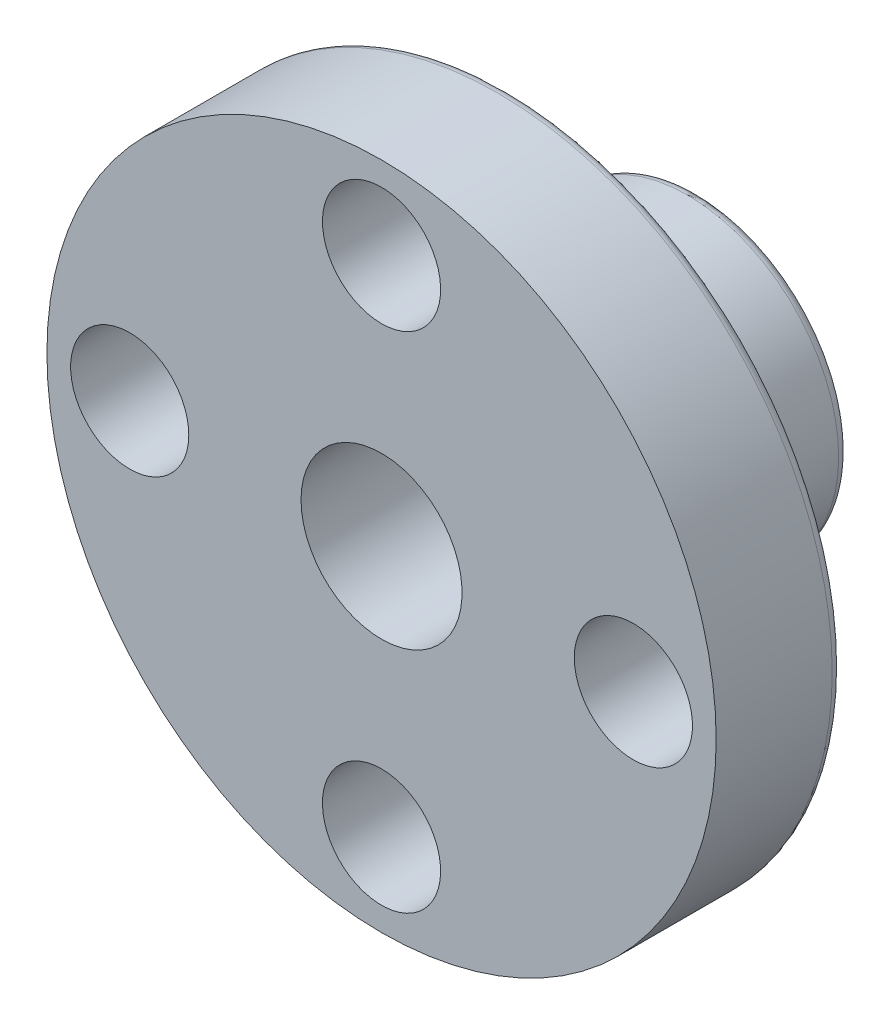
ISO-10303-21;
HEADER;
FILE_DESCRIPTION(('STEP AP214'),'2;1');
FILE_NAME('part.step','',(''),(''),'','','');
FILE_SCHEMA(('AUTOMOTIVE_DESIGN { 1 0 10303 214 1 1 1 1 }'));
ENDSEC;
DATA;
#1=APPLICATION_CONTEXT('core data for automotive mechanical design processes');
#2=APPLICATION_PROTOCOL_DEFINITION('international standard','automotive_design',2000,#1);
#3=PRODUCT_CONTEXT('',#1,'mechanical');
#4=PRODUCT('Part','Part','',(#3));
#5=PRODUCT_RELATED_PRODUCT_CATEGORY('part','',(#4));
#6=PRODUCT_DEFINITION_FORMATION('','',#4);
#7=PRODUCT_DEFINITION_CONTEXT('part definition',#1,'design');
#8=PRODUCT_DEFINITION('design','',#6,#7);
#9=PRODUCT_DEFINITION_SHAPE('','',#8);
#10=(LENGTH_UNIT() NAMED_UNIT(*) SI_UNIT(.MILLI.,.METRE.));
#11=(NAMED_UNIT(*) PLANE_ANGLE_UNIT() SI_UNIT($,.RADIAN.));
#12=(NAMED_UNIT(*) SI_UNIT($,.STERADIAN.) SOLID_ANGLE_UNIT());
#13=UNCERTAINTY_MEASURE_WITH_UNIT(LENGTH_MEASURE(1.E-05),#10,'distance_accuracy_value','');
#14=(GEOMETRIC_REPRESENTATION_CONTEXT(3) GLOBAL_UNCERTAINTY_ASSIGNED_CONTEXT((#13)) GLOBAL_UNIT_ASSIGNED_CONTEXT((#10,
#11,#12)) REPRESENTATION_CONTEXT('',''));
#15=CARTESIAN_POINT('',(0.,0.,0.));
#16=DIRECTION('',(0.,0.,1.));
#17=DIRECTION('',(1.,0.,0.));
#18=AXIS2_PLACEMENT_3D('',#15,#16,#17);
#19=CARTESIAN_POINT('',(0.,0.,30.48));
#20=DIRECTION('',(0.,0.,-1.));
#21=DIRECTION('',(-1.,0.,0.));
#22=AXIS2_PLACEMENT_3D('',#19,#20,#21);
#23=CYLINDRICAL_SURFACE('',#22,80.5625296455557);
#24=CARTESIAN_POINT('',(0.,0.,2.54));
#25=DIRECTION('',(0.,0.,1.));
#26=DIRECTION('',(1.,0.,0.));
#27=AXIS2_PLACEMENT_3D('',#24,#25,#26);
#28=CIRCLE('',#27,80.5625296455557);
#29=CARTESIAN_POINT('',(-80.5625296455557,0.,2.54));
#30=VERTEX_POINT('',#29);
#31=EDGE_CURVE('E46',#30,#30,#28,.T.);
#32=CARTESIAN_POINT('',(0.,0.,30.48));
#33=DIRECTION('',(0.,0.,1.));
#34=DIRECTION('',(1.,0.,0.));
#35=AXIS2_PLACEMENT_3D('',#32,#33,#34);
#36=CIRCLE('',#35,80.5625296455557);
#37=CARTESIAN_POINT('',(-80.5625296455557,0.,30.48));
#38=VERTEX_POINT('',#37);
#39=EDGE_CURVE('E65',#38,#38,#36,.T.);
#40=CARTESIAN_POINT('',(-80.5625296455557,0.,2.54));
#41=CARTESIAN_POINT('',(-80.5625296455557,0.,2.83104166666667));
#42=CARTESIAN_POINT('',(-80.5625296455557,0.,3.12208333333333));
#43=CARTESIAN_POINT('',(-80.5625296455557,0.,3.70416666666667));
#44=CARTESIAN_POINT('',(-80.5625296455557,0.,3.99520833333333));
#45=CARTESIAN_POINT('',(-80.5625296455557,0.,4.57729166666667));
#46=CARTESIAN_POINT('',(-80.5625296455557,0.,4.86833333333333));
#47=CARTESIAN_POINT('',(-80.5625296455557,0.,5.45041666666667));
#48=CARTESIAN_POINT('',(-80.5625296455557,0.,5.74145833333334));
#49=CARTESIAN_POINT('',(-80.5625296455557,0.,6.32354166666667));
#50=CARTESIAN_POINT('',(-80.5625296455557,0.,6.61458333333334));
#51=CARTESIAN_POINT('',(-80.5625296455557,0.,7.19666666666667));
#52=CARTESIAN_POINT('',(-80.5625296455557,0.,7.48770833333333));
#53=CARTESIAN_POINT('',(-80.5625296455557,0.,8.06979166666667));
#54=CARTESIAN_POINT('',(-80.5625296455557,0.,8.36083333333334));
#55=CARTESIAN_POINT('',(-80.5625296455557,0.,8.94291666666667));
#56=CARTESIAN_POINT('',(-80.5625296455557,0.,9.23395833333334));
#57=CARTESIAN_POINT('',(-80.5625296455557,0.,9.81604166666667));
#58=CARTESIAN_POINT('',(-80.5625296455557,0.,10.1070833333333));
#59=CARTESIAN_POINT('',(-80.5625296455557,0.,10.6891666666667));
#60=CARTESIAN_POINT('',(-80.5625296455557,0.,10.9802083333333));
#61=CARTESIAN_POINT('',(-80.5625296455557,0.,11.5622916666667));
#62=CARTESIAN_POINT('',(-80.5625296455557,0.,11.8533333333333));
#63=CARTESIAN_POINT('',(-80.5625296455557,0.,12.4354166666667));
#64=CARTESIAN_POINT('',(-80.5625296455557,0.,12.7264583333333));
#65=CARTESIAN_POINT('',(-80.5625296455557,0.,13.3085416666667));
#66=CARTESIAN_POINT('',(-80.5625296455557,0.,13.5995833333333));
#67=CARTESIAN_POINT('',(-80.5625296455557,0.,14.1816666666667));
#68=CARTESIAN_POINT('',(-80.5625296455557,0.,14.4727083333333));
#69=CARTESIAN_POINT('',(-80.5625296455557,0.,15.0547916666667));
#70=CARTESIAN_POINT('',(-80.5625296455557,0.,15.3458333333333));
#71=CARTESIAN_POINT('',(-80.5625296455557,0.,15.9279166666667));
#72=CARTESIAN_POINT('',(-80.5625296455557,0.,16.2189583333333));
#73=CARTESIAN_POINT('',(-80.5625296455557,0.,16.8010416666667));
#74=CARTESIAN_POINT('',(-80.5625296455557,0.,17.0920833333333));
#75=CARTESIAN_POINT('',(-80.5625296455557,0.,17.6741666666667));
#76=CARTESIAN_POINT('',(-80.5625296455557,0.,17.9652083333333));
#77=CARTESIAN_POINT('',(-80.5625296455557,0.,18.5472916666667));
#78=CARTESIAN_POINT('',(-80.5625296455557,0.,18.8383333333333));
#79=CARTESIAN_POINT('',(-80.5625296455557,0.,19.4204166666667));
#80=CARTESIAN_POINT('',(-80.5625296455557,0.,19.7114583333333));
#81=CARTESIAN_POINT('',(-80.5625296455557,0.,20.2935416666667));
#82=CARTESIAN_POINT('',(-80.5625296455557,0.,20.5845833333333));
#83=CARTESIAN_POINT('',(-80.5625296455557,0.,21.1666666666667));
#84=CARTESIAN_POINT('',(-80.5625296455557,0.,21.4577083333333));
#85=CARTESIAN_POINT('',(-80.5625296455557,0.,22.0397916666667));
#86=CARTESIAN_POINT('',(-80.5625296455557,0.,22.3308333333333));
#87=CARTESIAN_POINT('',(-80.5625296455557,0.,22.9129166666667));
#88=CARTESIAN_POINT('',(-80.5625296455557,0.,23.2039583333333));
#89=CARTESIAN_POINT('',(-80.5625296455557,0.,23.7860416666667));
#90=CARTESIAN_POINT('',(-80.5625296455557,0.,24.0770833333333));
#91=CARTESIAN_POINT('',(-80.5625296455557,0.,24.6591666666667));
#92=CARTESIAN_POINT('',(-80.5625296455557,0.,24.9502083333333));
#93=CARTESIAN_POINT('',(-80.5625296455557,0.,25.5322916666667));
#94=CARTESIAN_POINT('',(-80.5625296455557,0.,25.8233333333333));
#95=CARTESIAN_POINT('',(-80.5625296455557,0.,26.4054166666667));
#96=CARTESIAN_POINT('',(-80.5625296455557,0.,26.6964583333333));
#97=CARTESIAN_POINT('',(-80.5625296455557,0.,27.2785416666667));
#98=CARTESIAN_POINT('',(-80.5625296455557,0.,27.5695833333333));
#99=CARTESIAN_POINT('',(-80.5625296455557,0.,28.1516666666667));
#100=CARTESIAN_POINT('',(-80.5625296455557,0.,28.4427083333333));
#101=CARTESIAN_POINT('',(-80.5625296455557,0.,29.0247916666667));
#102=CARTESIAN_POINT('',(-80.5625296455557,0.,29.3158333333333));
#103=CARTESIAN_POINT('',(-80.5625296455557,0.,29.8979166666667));
#104=CARTESIAN_POINT('',(-80.5625296455557,0.,30.1889583333333));
#105=CARTESIAN_POINT('',(-80.5625296455557,0.,30.48));
#106=B_SPLINE_CURVE_WITH_KNOTS('',3,(#40,#41,#42,#43,#44,#45,#46,#47,#48,#49,#50,#51,#52,#53,
#54,#55,#56,#57,#58,#59,#60,#61,#62,#63,#64,#65,#66,#67,#68,#69,#70,#71,#72,#73,#74,#75,#76,#77,
#78,#79,#80,#81,#82,#83,#84,#85,#86,#87,#88,#89,#90,#91,#92,#93,#94,#95,#96,#97,#98,#99,#100,
#101,#102,#103,#104,#105),.UNSPECIFIED.,.F.,.F.,(4,2,2,2,2,2,2,2,2,2,2,2,2,2,2,2,2,2,2,2,2,2,2,
2,2,2,2,2,2,2,2,2,4),(0.,0.873124999999999,1.74625,2.619375,3.4925,4.365625,5.23875,6.111875,
6.985,7.858125,8.73125,9.604375,10.4775,11.350625,12.22375,13.096875,13.97,14.843125,15.71625,
16.589375,17.4625,18.335625,19.20875,20.081875,20.955,21.828125,22.70125,23.574375,24.4475,
25.320625,26.19375,27.066875,27.94),.UNSPECIFIED.);
#107=EDGE_CURVE('BSEAM39',#30,#38,#106,.T.);
#108=ORIENTED_EDGE('',*,*,#31,.T.);
#109=ORIENTED_EDGE('',*,*,#39,.F.);
#110=ORIENTED_EDGE('',*,*,#107,.T.);
#111=ORIENTED_EDGE('',*,*,#107,.F.);
#112=EDGE_LOOP('',(#108,#110,#109,#111));
#113=FACE_BOUND('',#112,.T.);
#114=ADVANCED_FACE('F39',(#113),#23,.T.);
#115=CARTESIAN_POINT('',(0.,0.,30.48));
#116=DIRECTION('',(0.,0.,1.));
#117=DIRECTION('',(1.,0.,0.));
#118=AXIS2_PLACEMENT_3D('',#115,#116,#117);
#119=PLANE('',#118);
#120=CARTESIAN_POINT('',(-60.6326289633329,0.,30.48));
#121=DIRECTION('',(0.,0.,-1.));
#122=DIRECTION('',(1.,0.,0.));
#123=AXIS2_PLACEMENT_3D('',#120,#121,#122);
#124=CIRCLE('',#123,14.2224685222633);
#125=CARTESIAN_POINT('',(-46.4101604410696,0.,30.48));
#126=VERTEX_POINT('',#125);
#127=EDGE_CURVE('E73',#126,#126,#124,.T.);
#128=ORIENTED_EDGE('',*,*,#127,.T.);
#129=EDGE_LOOP('',(#128));
#130=FACE_BOUND('',#129,.T.);
#131=CARTESIAN_POINT('',(6.35093077651429E-13,-60.6326289633329,30.48));
#132=DIRECTION('',(0.,0.,-1.));
#133=DIRECTION('',(0.,1.,0.));
#134=AXIS2_PLACEMENT_3D('',#131,#132,#133);
#135=CIRCLE('',#134,14.2224685222633);
#136=CARTESIAN_POINT('',(4.86120627338131E-13,-46.4101604410696,30.48));
#137=VERTEX_POINT('',#136);
#138=EDGE_CURVE('E93',#137,#137,#135,.T.);
#139=ORIENTED_EDGE('',*,*,#138,.T.);
#140=EDGE_LOOP('',(#139));
#141=FACE_BOUND('',#140,.T.);
#142=CARTESIAN_POINT('',(-2.11697692550476E-13,60.6326289633329,30.48));
#143=DIRECTION('',(0.,0.,-1.));
#144=DIRECTION('',(0.,-1.,0.));
#145=AXIS2_PLACEMENT_3D('',#142,#143,#144);
#146=CIRCLE('',#145,14.2224685222633);
#147=CARTESIAN_POINT('',(-1.6204020911271E-13,46.4101604410696,30.48));
#148=VERTEX_POINT('',#147);
#149=EDGE_CURVE('E69',#148,#148,#146,.T.);
#150=ORIENTED_EDGE('',*,*,#149,.T.);
#151=EDGE_LOOP('',(#150));
#152=FACE_BOUND('',#151,.T.);
#153=CARTESIAN_POINT('',(60.6326289633329,0.,30.48));
#154=DIRECTION('',(0.,0.,-1.));
#155=DIRECTION('',(-1.,0.,0.));
#156=AXIS2_PLACEMENT_3D('',#153,#154,#155);
#157=CIRCLE('',#156,14.2224685222633);
#158=CARTESIAN_POINT('',(46.4101604410696,0.,30.48));
#159=VERTEX_POINT('',#158);
#160=EDGE_CURVE('E77',#159,#159,#157,.T.);
#161=ORIENTED_EDGE('',*,*,#160,.T.);
#162=EDGE_LOOP('',(#161));
#163=FACE_BOUND('',#162,.T.);
#164=CARTESIAN_POINT('',(0.,0.,30.48));
#165=DIRECTION('',(0.,0.,-1.));
#166=DIRECTION('',(-1.,0.,0.));
#167=AXIS2_PLACEMENT_3D('',#164,#165,#166);
#168=CIRCLE('',#167,19.3838933480308);
#169=CARTESIAN_POINT('',(-19.3838933480308,0.,30.48));
#170=VERTEX_POINT('',#169);
#171=EDGE_CURVE('E84',#170,#170,#168,.T.);
#172=ORIENTED_EDGE('',*,*,#171,.T.);
#173=EDGE_LOOP('',(#172));
#174=FACE_BOUND('',#173,.T.);
#175=ORIENTED_EDGE('',*,*,#39,.T.);
#176=EDGE_LOOP('',(#175));
#177=FACE_BOUND('',#176,.T.);
#178=ADVANCED_FACE('F99',(#130,#141,#152,#163,#174,#177),#119,.T.);
#179=CARTESIAN_POINT('',(0.,0.,0.));
#180=DIRECTION('',(0.,0.,1.));
#181=DIRECTION('',(1.,0.,0.));
#182=AXIS2_PLACEMENT_3D('',#179,#180,#181);
#183=PLANE('',#182);
#184=CARTESIAN_POINT('',(0.,0.,0.));
#185=DIRECTION('',(0.,0.,1.));
#186=DIRECTION('',(1.,0.,0.));
#187=AXIS2_PLACEMENT_3D('',#184,#185,#186);
#188=CIRCLE('',#187,78.0225296455557);
#189=CARTESIAN_POINT('',(78.0225296455557,0.,0.));
#190=VERTEX_POINT('',#189);
#191=EDGE_CURVE('E10',#190,#190,#188,.F.);
#192=ORIENTED_EDGE('',*,*,#191,.T.);
#193=EDGE_LOOP('',(#192));
#194=FACE_BOUND('',#193,.T.);
#195=CARTESIAN_POINT('',(0.,0.,0.));
#196=DIRECTION('',(0.,0.,1.));
#197=DIRECTION('',(1.,0.,0.));
#198=AXIS2_PLACEMENT_3D('',#195,#196,#197);
#199=CIRCLE('',#198,38.9467974134491);
#200=CARTESIAN_POINT('',(38.9467974134491,0.,0.));
#201=VERTEX_POINT('',#200);
#202=EDGE_CURVE('E54',#201,#201,#199,.T.);
#203=ORIENTED_EDGE('',*,*,#202,.T.);
#204=EDGE_LOOP('',(#203));
#205=FACE_BOUND('',#204,.T.);
#206=CARTESIAN_POINT('',(-60.6326289633329,0.,0.));
#207=DIRECTION('',(0.,0.,1.));
#208=DIRECTION('',(1.,0.,0.));
#209=AXIS2_PLACEMENT_3D('',#206,#207,#208);
#210=CIRCLE('',#209,14.2224685222633);
#211=CARTESIAN_POINT('',(-46.4101604410696,0.,0.));
#212=VERTEX_POINT('',#211);
#213=EDGE_CURVE('E66',#212,#212,#210,.T.);
#214=ORIENTED_EDGE('',*,*,#213,.T.);
#215=EDGE_LOOP('',(#214));
#216=FACE_BOUND('',#215,.T.);
#217=CARTESIAN_POINT('',(6.35093077651429E-13,-60.6326289633329,0.));
#218=DIRECTION('',(0.,0.,1.));
#219=DIRECTION('',(1.,0.,0.));
#220=AXIS2_PLACEMENT_3D('',#217,#218,#219);
#221=CIRCLE('',#220,14.2224685222633);
#222=CARTESIAN_POINT('',(14.2224685222639,-60.6326289633329,0.));
#223=VERTEX_POINT('',#222);
#224=EDGE_CURVE('E70',#223,#223,#221,.T.);
#225=ORIENTED_EDGE('',*,*,#224,.T.);
#226=EDGE_LOOP('',(#225));
#227=FACE_BOUND('',#226,.T.);
#228=CARTESIAN_POINT('',(-2.11697692550476E-13,60.6326289633329,0.));
#229=DIRECTION('',(0.,0.,1.));
#230=DIRECTION('',(1.,0.,0.));
#231=AXIS2_PLACEMENT_3D('',#228,#229,#230);
#232=CIRCLE('',#231,14.2224685222633);
#233=CARTESIAN_POINT('',(14.2224685222631,60.6326289633329,0.));
#234=VERTEX_POINT('',#233);
#235=EDGE_CURVE('E74',#234,#234,#232,.T.);
#236=ORIENTED_EDGE('',*,*,#235,.T.);
#237=EDGE_LOOP('',(#236));
#238=FACE_BOUND('',#237,.T.);
#239=CARTESIAN_POINT('',(60.6326289633329,0.,0.));
#240=DIRECTION('',(0.,0.,1.));
#241=DIRECTION('',(1.,0.,0.));
#242=AXIS2_PLACEMENT_3D('',#239,#240,#241);
#243=CIRCLE('',#242,14.2224685222633);
#244=CARTESIAN_POINT('',(74.8550974855962,0.,0.));
#245=VERTEX_POINT('',#244);
#246=EDGE_CURVE('E78',#245,#245,#243,.T.);
#247=ORIENTED_EDGE('',*,*,#246,.T.);
#248=EDGE_LOOP('',(#247));
#249=FACE_BOUND('',#248,.T.);
#250=ADVANCED_FACE('F110',(#194,#205,#216,#227,#238,#249),#183,.F.);
#251=CARTESIAN_POINT('',(0.,0.,-45.72));
#252=DIRECTION('',(0.,0.,1.));
#253=DIRECTION('',(1.,0.,0.));
#254=AXIS2_PLACEMENT_3D('',#251,#252,#253);
#255=CYLINDRICAL_SURFACE('',#254,36.4067974134491);
#256=CARTESIAN_POINT('',(0.,0.,-2.54));
#257=DIRECTION('',(0.,0.,1.));
#258=DIRECTION('',(1.,0.,0.));
#259=AXIS2_PLACEMENT_3D('',#256,#257,#258);
#260=CIRCLE('',#259,36.4067974134491);
#261=CARTESIAN_POINT('',(36.4067974134491,0.,-2.54));
#262=VERTEX_POINT('',#261);
#263=EDGE_CURVE('E59',#262,#262,#260,.F.);
#264=ORIENTED_EDGE('',*,*,#263,.T.);
#265=EDGE_LOOP('',(#264));
#266=FACE_BOUND('',#265,.T.);
#267=CARTESIAN_POINT('',(0.,0.,-43.18));
#268=DIRECTION('',(0.,0.,-1.));
#269=DIRECTION('',(-1.,0.,0.));
#270=AXIS2_PLACEMENT_3D('',#267,#268,#269);
#271=CIRCLE('',#270,36.4067974134491);
#272=CARTESIAN_POINT('',(-36.4067974134491,0.,-43.18));
#273=VERTEX_POINT('',#272);
#274=EDGE_CURVE('E62',#273,#273,#271,.F.);
#275=ORIENTED_EDGE('',*,*,#274,.T.);
#276=EDGE_LOOP('',(#275));
#277=FACE_BOUND('',#276,.T.);
#278=ADVANCED_FACE('F113',(#266,#277),#255,.T.);
#279=CARTESIAN_POINT('',(0.,0.,-45.72));
#280=DIRECTION('',(0.,0.,-1.));
#281=DIRECTION('',(-1.,0.,0.));
#282=AXIS2_PLACEMENT_3D('',#279,#280,#281);
#283=PLANE('',#282);
#284=CARTESIAN_POINT('',(0.,0.,-45.72));
#285=DIRECTION('',(0.,0.,-1.));
#286=DIRECTION('',(-1.,0.,0.));
#287=AXIS2_PLACEMENT_3D('',#284,#285,#286);
#288=CIRCLE('',#287,33.8667974134491);
#289=CARTESIAN_POINT('',(-33.8667974134491,0.,-45.72));
#290=VERTEX_POINT('',#289);
#291=EDGE_CURVE('E50',#290,#290,#288,.T.);
#292=ORIENTED_EDGE('',*,*,#291,.T.);
#293=EDGE_LOOP('',(#292));
#294=FACE_BOUND('',#293,.T.);
#295=CARTESIAN_POINT('',(0.,0.,-45.72));
#296=DIRECTION('',(0.,0.,-1.));
#297=DIRECTION('',(-1.,0.,0.));
#298=AXIS2_PLACEMENT_3D('',#295,#296,#297);
#299=CIRCLE('',#298,19.3838933480308);
#300=CARTESIAN_POINT('',(-19.3838933480308,0.,-45.72));
#301=VERTEX_POINT('',#300);
#302=EDGE_CURVE('E81',#301,#301,#299,.T.);
#303=ORIENTED_EDGE('',*,*,#302,.F.);
#304=EDGE_LOOP('',(#303));
#305=FACE_BOUND('',#304,.T.);
#306=ADVANCED_FACE('F133',(#294,#305),#283,.T.);
#307=CARTESIAN_POINT('',(0.,0.,30.48));
#308=DIRECTION('',(0.,0.,-1.));
#309=DIRECTION('',(-1.,0.,0.));
#310=AXIS2_PLACEMENT_3D('',#307,#308,#309);
#311=CYLINDRICAL_SURFACE('',#310,19.3838933480308);
#312=CARTESIAN_POINT('',(-19.3838933480308,0.,30.48));
#313=CARTESIAN_POINT('',(-19.3838933480308,0.,29.68625));
#314=CARTESIAN_POINT('',(-19.3838933480308,0.,28.8925));
#315=CARTESIAN_POINT('',(-19.3838933480308,0.,27.305));
#316=CARTESIAN_POINT('',(-19.3838933480308,0.,26.51125));
#317=CARTESIAN_POINT('',(-19.3838933480308,0.,24.92375));
#318=CARTESIAN_POINT('',(-19.3838933480308,0.,24.13));
#319=CARTESIAN_POINT('',(-19.3838933480308,0.,22.5425));
#320=CARTESIAN_POINT('',(-19.3838933480308,0.,21.74875));
#321=CARTESIAN_POINT('',(-19.3838933480308,0.,20.16125));
#322=CARTESIAN_POINT('',(-19.3838933480308,0.,19.3675));
#323=CARTESIAN_POINT('',(-19.3838933480308,0.,17.78));
#324=CARTESIAN_POINT('',(-19.3838933480308,0.,16.98625));
#325=CARTESIAN_POINT('',(-19.3838933480308,0.,15.39875));
#326=CARTESIAN_POINT('',(-19.3838933480308,0.,14.605));
#327=CARTESIAN_POINT('',(-19.3838933480308,0.,13.0175));
#328=CARTESIAN_POINT('',(-19.3838933480308,0.,12.22375));
#329=CARTESIAN_POINT('',(-19.3838933480308,0.,10.63625));
#330=CARTESIAN_POINT('',(-19.3838933480308,0.,9.8425));
#331=CARTESIAN_POINT('',(-19.3838933480308,0.,8.255));
#332=CARTESIAN_POINT('',(-19.3838933480308,0.,7.46125));
#333=CARTESIAN_POINT('',(-19.3838933480308,0.,5.87375));
#334=CARTESIAN_POINT('',(-19.3838933480308,0.,5.08));
#335=CARTESIAN_POINT('',(-19.3838933480308,0.,3.4925));
#336=CARTESIAN_POINT('',(-19.3838933480308,0.,2.69875));
#337=CARTESIAN_POINT('',(-19.3838933480308,0.,1.11125));
#338=CARTESIAN_POINT('',(-19.3838933480308,0.,0.3175));
#339=CARTESIAN_POINT('',(-19.3838933480308,0.,-1.27));
#340=CARTESIAN_POINT('',(-19.3838933480308,0.,-2.06375));
#341=CARTESIAN_POINT('',(-19.3838933480308,0.,-3.65125));
#342=CARTESIAN_POINT('',(-19.3838933480308,0.,-4.445));
#343=CARTESIAN_POINT('',(-19.3838933480308,0.,-6.0325));
#344=CARTESIAN_POINT('',(-19.3838933480308,0.,-6.82625));
#345=CARTESIAN_POINT('',(-19.3838933480308,0.,-8.41375));
#346=CARTESIAN_POINT('',(-19.3838933480308,0.,-9.2075));
#347=CARTESIAN_POINT('',(-19.3838933480308,0.,-10.795));
#348=CARTESIAN_POINT('',(-19.3838933480308,0.,-11.58875));
#349=CARTESIAN_POINT('',(-19.3838933480308,0.,-13.17625));
#350=CARTESIAN_POINT('',(-19.3838933480308,0.,-13.97));
#351=CARTESIAN_POINT('',(-19.3838933480308,0.,-15.5575));
#352=CARTESIAN_POINT('',(-19.3838933480308,0.,-16.35125));
#353=CARTESIAN_POINT('',(-19.3838933480308,0.,-17.93875));
#354=CARTESIAN_POINT('',(-19.3838933480308,0.,-18.7325));
#355=CARTESIAN_POINT('',(-19.3838933480308,0.,-20.32));
#356=CARTESIAN_POINT('',(-19.3838933480308,0.,-21.11375));
#357=CARTESIAN_POINT('',(-19.3838933480308,0.,-22.70125));
#358=CARTESIAN_POINT('',(-19.3838933480308,0.,-23.495));
#359=CARTESIAN_POINT('',(-19.3838933480308,0.,-25.0825));
#360=CARTESIAN_POINT('',(-19.3838933480308,0.,-25.87625));
#361=CARTESIAN_POINT('',(-19.3838933480308,0.,-27.46375));
#362=CARTESIAN_POINT('',(-19.3838933480308,0.,-28.2575));
#363=CARTESIAN_POINT('',(-19.3838933480308,0.,-29.845));
#364=CARTESIAN_POINT('',(-19.3838933480308,0.,-30.63875));
#365=CARTESIAN_POINT('',(-19.3838933480308,0.,-32.22625));
#366=CARTESIAN_POINT('',(-19.3838933480308,0.,-33.02));
#367=CARTESIAN_POINT('',(-19.3838933480308,0.,-34.6075));
#368=CARTESIAN_POINT('',(-19.3838933480308,0.,-35.40125));
#369=CARTESIAN_POINT('',(-19.3838933480308,0.,-36.98875));
#370=CARTESIAN_POINT('',(-19.3838933480308,0.,-37.7825));
#371=CARTESIAN_POINT('',(-19.3838933480308,0.,-39.37));
#372=CARTESIAN_POINT('',(-19.3838933480308,0.,-40.16375));
#373=CARTESIAN_POINT('',(-19.3838933480308,0.,-41.75125));
#374=CARTESIAN_POINT('',(-19.3838933480308,0.,-42.545));
#375=CARTESIAN_POINT('',(-19.3838933480308,0.,-44.1325));
#376=CARTESIAN_POINT('',(-19.3838933480308,0.,-44.92625));
#377=CARTESIAN_POINT('',(-19.3838933480308,0.,-45.72));
#378=B_SPLINE_CURVE_WITH_KNOTS('',3,(#312,#313,#314,#315,#316,#317,#318,#319,#320,#321,#322,
#323,#324,#325,#326,#327,#328,#329,#330,#331,#332,#333,#334,#335,#336,#337,#338,#339,#340,#341,
#342,#343,#344,#345,#346,#347,#348,#349,#350,#351,#352,#353,#354,#355,#356,#357,#358,#359,#360,
#361,#362,#363,#364,#365,#366,#367,#368,#369,#370,#371,#372,#373,#374,#375,#376,#377),
.UNSPECIFIED.,.F.,.F.,(4,2,2,2,2,2,2,2,2,2,2,2,2,2,2,2,2,2,2,2,2,2,2,2,2,2,2,2,2,2,2,2,4),(0.,
2.38125,4.7625,7.14375,9.525,11.90625,14.2875,16.66875,19.05,21.43125,23.8125,26.19375,28.575,
30.95625,33.3375,35.71875,38.1,40.48125,42.8625,45.24375,47.625,50.00625,52.3875,54.76875,57.15,
59.53125,61.9125,64.29375,66.675,69.05625,71.4375,73.81875,76.2),.UNSPECIFIED.);
#379=EDGE_CURVE('BSEAM124',#170,#301,#378,.T.);
#380=ORIENTED_EDGE('',*,*,#171,.F.);
#381=ORIENTED_EDGE('',*,*,#302,.T.);
#382=ORIENTED_EDGE('',*,*,#379,.T.);
#383=ORIENTED_EDGE('',*,*,#379,.F.);
#384=EDGE_LOOP('',(#380,#382,#381,#383));
#385=FACE_BOUND('',#384,.T.);
#386=ADVANCED_FACE('F124',(#385),#311,.F.);
#387=CARTESIAN_POINT('',(60.6326289633329,0.,30.48));
#388=DIRECTION('',(0.,0.,-1.));
#389=DIRECTION('',(-1.,0.,0.));
#390=AXIS2_PLACEMENT_3D('',#387,#388,#389);
#391=CYLINDRICAL_SURFACE('',#390,14.2224685222633);
#392=ORIENTED_EDGE('',*,*,#160,.F.);
#393=EDGE_LOOP('',(#392));
#394=FACE_BOUND('',#393,.T.);
#395=ORIENTED_EDGE('',*,*,#246,.F.);
#396=EDGE_LOOP('',(#395));
#397=FACE_BOUND('',#396,.T.);
#398=ADVANCED_FACE('F121',(#394,#397),#391,.F.);
#399=CARTESIAN_POINT('',(-2.11697692550476E-13,60.6326289633329,30.48));
#400=DIRECTION('',(0.,0.,-1.));
#401=DIRECTION('',(-1.,0.,0.));
#402=AXIS2_PLACEMENT_3D('',#399,#400,#401);
#403=CYLINDRICAL_SURFACE('',#402,14.2224685222633);
#404=ORIENTED_EDGE('',*,*,#149,.F.);
#405=EDGE_LOOP('',(#404));
#406=FACE_BOUND('',#405,.T.);
#407=ORIENTED_EDGE('',*,*,#235,.F.);
#408=EDGE_LOOP('',(#407));
#409=FACE_BOUND('',#408,.T.);
#410=ADVANCED_FACE('F123',(#406,#409),#403,.F.);
#411=CARTESIAN_POINT('',(6.35093077651429E-13,-60.6326289633329,30.48));
#412=DIRECTION('',(0.,0.,-1.));
#413=DIRECTION('',(-1.,0.,0.));
#414=AXIS2_PLACEMENT_3D('',#411,#412,#413);
#415=CYLINDRICAL_SURFACE('',#414,14.2224685222633);
#416=ORIENTED_EDGE('',*,*,#138,.F.);
#417=EDGE_LOOP('',(#416));
#418=FACE_BOUND('',#417,.T.);
#419=ORIENTED_EDGE('',*,*,#224,.F.);
#420=EDGE_LOOP('',(#419));
#421=FACE_BOUND('',#420,.T.);
#422=ADVANCED_FACE('F106',(#418,#421),#415,.F.);
#423=CARTESIAN_POINT('',(-60.6326289633329,0.,30.48));
#424=DIRECTION('',(0.,0.,-1.));
#425=DIRECTION('',(-1.,0.,0.));
#426=AXIS2_PLACEMENT_3D('',#423,#424,#425);
#427=CYLINDRICAL_SURFACE('',#426,14.2224685222633);
#428=ORIENTED_EDGE('',*,*,#127,.F.);
#429=EDGE_LOOP('',(#428));
#430=FACE_BOUND('',#429,.T.);
#431=ORIENTED_EDGE('',*,*,#213,.F.);
#432=EDGE_LOOP('',(#431));
#433=FACE_BOUND('',#432,.T.);
#434=ADVANCED_FACE('F102',(#430,#433),#427,.F.);
#435=CARTESIAN_POINT('',(0.,0.,-2.54));
#436=DIRECTION('',(0.,0.,1.));
#437=DIRECTION('',(1.,0.,0.));
#438=AXIS2_PLACEMENT_3D('',#435,#436,#437);
#439=TOROIDAL_SURFACE('',#438,38.9467974134491,2.54);
#440=ORIENTED_EDGE('',*,*,#202,.F.);
#441=EDGE_LOOP('',(#440));
#442=FACE_BOUND('',#441,.T.);
#443=ORIENTED_EDGE('',*,*,#263,.F.);
#444=EDGE_LOOP('',(#443));
#445=FACE_BOUND('',#444,.T.);
#446=ADVANCED_FACE('F105',(#442,#445),#439,.F.);
#447=CARTESIAN_POINT('',(0.,0.,-43.18));
#448=DIRECTION('',(0.,0.,-1.));
#449=DIRECTION('',(-1.,0.,0.));
#450=AXIS2_PLACEMENT_3D('',#447,#448,#449);
#451=TOROIDAL_SURFACE('',#450,33.8667974134491,2.54);
#452=ORIENTED_EDGE('',*,*,#274,.F.);
#453=EDGE_LOOP('',(#452));
#454=FACE_BOUND('',#453,.T.);
#455=ORIENTED_EDGE('',*,*,#291,.F.);
#456=EDGE_LOOP('',(#455));
#457=FACE_BOUND('',#456,.T.);
#458=ADVANCED_FACE('F146',(#454,#457),#451,.T.);
#459=CARTESIAN_POINT('',(0.,0.,2.54));
#460=DIRECTION('',(0.,0.,1.));
#461=DIRECTION('',(1.,0.,0.));
#462=AXIS2_PLACEMENT_3D('',#459,#460,#461);
#463=TOROIDAL_SURFACE('',#462,78.0225296455557,2.54);
#464=ORIENTED_EDGE('',*,*,#191,.F.);
#465=EDGE_LOOP('',(#464));
#466=FACE_BOUND('',#465,.T.);
#467=ORIENTED_EDGE('',*,*,#31,.F.);
#468=EDGE_LOOP('',(#467));
#469=FACE_BOUND('',#468,.T.);
#470=ADVANCED_FACE('F41',(#466,#469),#463,.T.);
#471=CLOSED_SHELL('',(#114,#178,#250,#278,#306,#386,#398,#410,#422,#434,#446,#458,#470));
#472=MANIFOLD_SOLID_BREP('B2',#471);
#473=ADVANCED_BREP_SHAPE_REPRESENTATION('',(#18,#472),#14);
#474=SHAPE_DEFINITION_REPRESENTATION(#9,#473);
ENDSEC;
END-ISO-10303-21;
